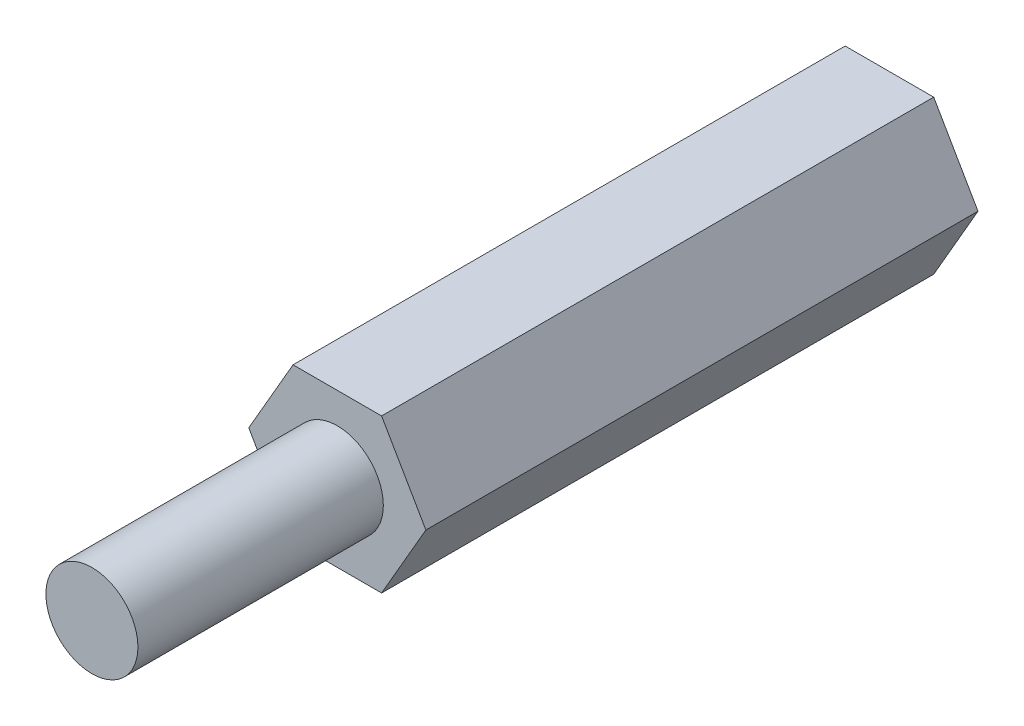
ISO-10303-21;
HEADER;
FILE_DESCRIPTION(('STEP AP214'),'2;1');
FILE_NAME('part.step','',(''),(''),'','','');
FILE_SCHEMA(('AUTOMOTIVE_DESIGN { 1 0 10303 214 1 1 1 1 }'));
ENDSEC;
DATA;
#1=APPLICATION_CONTEXT('core data for automotive mechanical design processes');
#2=APPLICATION_PROTOCOL_DEFINITION('international standard','automotive_design',2000,#1);
#3=PRODUCT_CONTEXT('',#1,'mechanical');
#4=PRODUCT('Part','Part','',(#3));
#5=PRODUCT_RELATED_PRODUCT_CATEGORY('part','',(#4));
#6=PRODUCT_DEFINITION_FORMATION('','',#4);
#7=PRODUCT_DEFINITION_CONTEXT('part definition',#1,'design');
#8=PRODUCT_DEFINITION('design','',#6,#7);
#9=PRODUCT_DEFINITION_SHAPE('','',#8);
#10=(LENGTH_UNIT() NAMED_UNIT(*) SI_UNIT(.MILLI.,.METRE.));
#11=(NAMED_UNIT(*) PLANE_ANGLE_UNIT() SI_UNIT($,.RADIAN.));
#12=(NAMED_UNIT(*) SI_UNIT($,.STERADIAN.) SOLID_ANGLE_UNIT());
#13=UNCERTAINTY_MEASURE_WITH_UNIT(LENGTH_MEASURE(1.E-05),#10,'distance_accuracy_value','');
#14=(GEOMETRIC_REPRESENTATION_CONTEXT(3) GLOBAL_UNCERTAINTY_ASSIGNED_CONTEXT((#13)) GLOBAL_UNIT_ASSIGNED_CONTEXT((#10,
#11,#12)) REPRESENTATION_CONTEXT('',''));
#15=CARTESIAN_POINT('',(0.,0.,0.));
#16=DIRECTION('',(0.,0.,1.));
#17=DIRECTION('',(1.,0.,0.));
#18=AXIS2_PLACEMENT_3D('',#15,#16,#17);
#19=CARTESIAN_POINT('',(1.44337567297407,2.5,18.));
#20=DIRECTION('',(0.,-1.,0.));
#21=DIRECTION('',(0.,0.,-1.));
#22=AXIS2_PLACEMENT_3D('',#19,#20,#21);
#23=PLANE('',#22);
#24=DIRECTION('',(-1.,0.,0.));
#25=VECTOR('',#24,1.);
#26=CARTESIAN_POINT('',(1.44337567297407,2.5,0.));
#27=LINE('',#26,#25);
#28=CARTESIAN_POINT('',(1.44337567297407,2.5,0.));
#29=VERTEX_POINT('',#28);
#30=CARTESIAN_POINT('',(-1.44337567297406,2.5,0.));
#31=VERTEX_POINT('',#30);
#32=EDGE_CURVE('E124',#29,#31,#27,.T.);
#33=ORIENTED_EDGE('',*,*,#32,.T.);
#34=DIRECTION('',(0.,0.,-1.));
#35=VECTOR('',#34,1.);
#36=CARTESIAN_POINT('',(-1.44337567297406,2.5,18.));
#37=LINE('',#36,#35);
#38=CARTESIAN_POINT('',(-1.44337567297406,2.5,18.));
#39=VERTEX_POINT('',#38);
#40=EDGE_CURVE('E11',#39,#31,#37,.T.);
#41=ORIENTED_EDGE('',*,*,#40,.F.);
#42=DIRECTION('',(-1.,0.,0.));
#43=VECTOR('',#42,1.);
#44=CARTESIAN_POINT('',(1.44337567297407,2.5,18.));
#45=LINE('',#44,#43);
#46=CARTESIAN_POINT('',(1.44337567297407,2.5,18.));
#47=VERTEX_POINT('',#46);
#48=EDGE_CURVE('E135',#47,#39,#45,.T.);
#49=ORIENTED_EDGE('',*,*,#48,.F.);
#50=DIRECTION('',(0.,0.,-1.));
#51=VECTOR('',#50,1.);
#52=CARTESIAN_POINT('',(1.44337567297407,2.5,18.));
#53=LINE('',#52,#51);
#54=EDGE_CURVE('E120',#47,#29,#53,.T.);
#55=ORIENTED_EDGE('',*,*,#54,.T.);
#56=EDGE_LOOP('',(#33,#41,#49,#55));
#57=FACE_BOUND('',#56,.T.);
#58=ADVANCED_FACE('F38',(#57),#23,.F.);
#59=CARTESIAN_POINT('',(-1.44337567297406,2.5,18.));
#60=DIRECTION('',(0.866025403784439,-0.5,0.));
#61=DIRECTION('',(0.5,0.866025403784439,0.));
#62=AXIS2_PLACEMENT_3D('',#59,#60,#61);
#63=PLANE('',#62);
#64=DIRECTION('',(-0.5,-0.866025403784439,0.));
#65=VECTOR('',#64,1.);
#66=CARTESIAN_POINT('',(-1.44337567297406,2.5,0.));
#67=LINE('',#66,#65);
#68=CARTESIAN_POINT('',(-2.88675134594813,0.,0.));
#69=VERTEX_POINT('',#68);
#70=EDGE_CURVE('E127',#31,#69,#67,.T.);
#71=ORIENTED_EDGE('',*,*,#70,.T.);
#72=DIRECTION('',(0.,0.,-1.));
#73=VECTOR('',#72,1.);
#74=CARTESIAN_POINT('',(-2.88675134594813,0.,18.));
#75=LINE('',#74,#73);
#76=CARTESIAN_POINT('',(-2.88675134594813,0.,18.));
#77=VERTEX_POINT('',#76);
#78=EDGE_CURVE('E46',#77,#69,#75,.T.);
#79=ORIENTED_EDGE('',*,*,#78,.F.);
#80=DIRECTION('',(-0.5,-0.866025403784439,0.));
#81=VECTOR('',#80,1.);
#82=CARTESIAN_POINT('',(-1.44337567297406,2.5,18.));
#83=LINE('',#82,#81);
#84=EDGE_CURVE('E92',#39,#77,#83,.T.);
#85=ORIENTED_EDGE('',*,*,#84,.F.);
#86=ORIENTED_EDGE('',*,*,#40,.T.);
#87=EDGE_LOOP('',(#71,#79,#85,#86));
#88=FACE_BOUND('',#87,.T.);
#89=ADVANCED_FACE('F160',(#88),#63,.F.);
#90=CARTESIAN_POINT('',(-2.88675134594813,0.,18.));
#91=DIRECTION('',(0.866025403784438,0.5,0.));
#92=DIRECTION('',(-0.5,0.866025403784438,0.));
#93=AXIS2_PLACEMENT_3D('',#90,#91,#92);
#94=PLANE('',#93);
#95=DIRECTION('',(0.5,-0.866025403784438,0.));
#96=VECTOR('',#95,1.);
#97=CARTESIAN_POINT('',(-2.88675134594813,0.,0.));
#98=LINE('',#97,#96);
#99=CARTESIAN_POINT('',(-1.44337567297406,-2.5,0.));
#100=VERTEX_POINT('',#99);
#101=EDGE_CURVE('E130',#69,#100,#98,.T.);
#102=ORIENTED_EDGE('',*,*,#101,.T.);
#103=DIRECTION('',(0.,0.,-1.));
#104=VECTOR('',#103,1.);
#105=CARTESIAN_POINT('',(-1.44337567297406,-2.5,18.));
#106=LINE('',#105,#104);
#107=CARTESIAN_POINT('',(-1.44337567297406,-2.5,18.));
#108=VERTEX_POINT('',#107);
#109=EDGE_CURVE('E115',#108,#100,#106,.T.);
#110=ORIENTED_EDGE('',*,*,#109,.F.);
#111=DIRECTION('',(0.5,-0.866025403784438,0.));
#112=VECTOR('',#111,1.);
#113=CARTESIAN_POINT('',(-2.88675134594813,0.,18.));
#114=LINE('',#113,#112);
#115=EDGE_CURVE('E106',#77,#108,#114,.T.);
#116=ORIENTED_EDGE('',*,*,#115,.F.);
#117=ORIENTED_EDGE('',*,*,#78,.T.);
#118=EDGE_LOOP('',(#102,#110,#116,#117));
#119=FACE_BOUND('',#118,.T.);
#120=ADVANCED_FACE('F141',(#119),#94,.F.);
#121=CARTESIAN_POINT('',(-1.44337567297406,-2.5,18.));
#122=DIRECTION('',(0.,1.,0.));
#123=DIRECTION('',(-1.,0.,0.));
#124=AXIS2_PLACEMENT_3D('',#121,#122,#123);
#125=PLANE('',#124);
#126=DIRECTION('',(1.,0.,0.));
#127=VECTOR('',#126,1.);
#128=CARTESIAN_POINT('',(-1.44337567297406,-2.5,0.));
#129=LINE('',#128,#127);
#130=CARTESIAN_POINT('',(1.44337567297406,-2.5,0.));
#131=VERTEX_POINT('',#130);
#132=EDGE_CURVE('E114',#100,#131,#129,.T.);
#133=ORIENTED_EDGE('',*,*,#132,.T.);
#134=DIRECTION('',(0.,0.,-1.));
#135=VECTOR('',#134,1.);
#136=CARTESIAN_POINT('',(1.44337567297406,-2.5,18.));
#137=LINE('',#136,#135);
#138=CARTESIAN_POINT('',(1.44337567297406,-2.5,18.));
#139=VERTEX_POINT('',#138);
#140=EDGE_CURVE('E111',#139,#131,#137,.T.);
#141=ORIENTED_EDGE('',*,*,#140,.F.);
#142=DIRECTION('',(1.,0.,0.));
#143=VECTOR('',#142,1.);
#144=CARTESIAN_POINT('',(-1.44337567297406,-2.5,18.));
#145=LINE('',#144,#143);
#146=EDGE_CURVE('E100',#108,#139,#145,.T.);
#147=ORIENTED_EDGE('',*,*,#146,.F.);
#148=ORIENTED_EDGE('',*,*,#109,.T.);
#149=EDGE_LOOP('',(#133,#141,#147,#148));
#150=FACE_BOUND('',#149,.T.);
#151=ADVANCED_FACE('F112',(#150),#125,.F.);
#152=CARTESIAN_POINT('',(1.44337567297406,-2.5,18.));
#153=DIRECTION('',(-0.866025403784439,0.5,0.));
#154=DIRECTION('',(-0.5,-0.866025403784439,0.));
#155=AXIS2_PLACEMENT_3D('',#152,#153,#154);
#156=PLANE('',#155);
#157=DIRECTION('',(0.5,0.866025403784439,0.));
#158=VECTOR('',#157,1.);
#159=CARTESIAN_POINT('',(1.44337567297406,-2.5,0.));
#160=LINE('',#159,#158);
#161=CARTESIAN_POINT('',(2.88675134594813,0.,0.));
#162=VERTEX_POINT('',#161);
#163=EDGE_CURVE('E78',#131,#162,#160,.T.);
#164=ORIENTED_EDGE('',*,*,#163,.T.);
#165=DIRECTION('',(0.,0.,-1.));
#166=VECTOR('',#165,1.);
#167=CARTESIAN_POINT('',(2.88675134594813,0.,18.));
#168=LINE('',#167,#166);
#169=CARTESIAN_POINT('',(2.88675134594813,0.,18.));
#170=VERTEX_POINT('',#169);
#171=EDGE_CURVE('E116',#170,#162,#168,.T.);
#172=ORIENTED_EDGE('',*,*,#171,.F.);
#173=DIRECTION('',(0.5,0.866025403784439,0.));
#174=VECTOR('',#173,1.);
#175=CARTESIAN_POINT('',(1.44337567297406,-2.5,18.));
#176=LINE('',#175,#174);
#177=EDGE_CURVE('E104',#139,#170,#176,.T.);
#178=ORIENTED_EDGE('',*,*,#177,.F.);
#179=ORIENTED_EDGE('',*,*,#140,.T.);
#180=EDGE_LOOP('',(#164,#172,#178,#179));
#181=FACE_BOUND('',#180,.T.);
#182=ADVANCED_FACE('F118',(#181),#156,.F.);
#183=CARTESIAN_POINT('',(2.88675134594813,0.,18.));
#184=DIRECTION('',(-0.866025403784439,-0.5,0.));
#185=DIRECTION('',(0.5,-0.866025403784439,0.));
#186=AXIS2_PLACEMENT_3D('',#183,#184,#185);
#187=PLANE('',#186);
#188=DIRECTION('',(-0.5,0.866025403784439,0.));
#189=VECTOR('',#188,1.);
#190=CARTESIAN_POINT('',(2.88675134594813,0.,0.));
#191=LINE('',#190,#189);
#192=EDGE_CURVE('E84',#162,#29,#191,.T.);
#193=ORIENTED_EDGE('',*,*,#192,.T.);
#194=ORIENTED_EDGE('',*,*,#54,.F.);
#195=DIRECTION('',(-0.5,0.866025403784439,0.));
#196=VECTOR('',#195,1.);
#197=CARTESIAN_POINT('',(2.88675134594813,0.,18.));
#198=LINE('',#197,#196);
#199=EDGE_CURVE('E54',#170,#47,#198,.T.);
#200=ORIENTED_EDGE('',*,*,#199,.F.);
#201=ORIENTED_EDGE('',*,*,#171,.T.);
#202=EDGE_LOOP('',(#193,#194,#200,#201));
#203=FACE_BOUND('',#202,.T.);
#204=ADVANCED_FACE('F148',(#203),#187,.F.);
#205=CARTESIAN_POINT('',(0.,0.,18.));
#206=DIRECTION('',(0.,0.,1.));
#207=DIRECTION('',(1.,0.,0.));
#208=AXIS2_PLACEMENT_3D('',#205,#206,#207);
#209=PLANE('',#208);
#210=CARTESIAN_POINT('',(0.,0.,18.));
#211=DIRECTION('',(0.,0.,1.));
#212=DIRECTION('',(1.,0.,0.));
#213=AXIS2_PLACEMENT_3D('',#210,#211,#212);
#214=CIRCLE('',#213,1.5);
#215=CARTESIAN_POINT('',(1.5,0.,18.));
#216=VERTEX_POINT('',#215);
#217=EDGE_CURVE('E251',#216,#216,#214,.T.);
#218=ORIENTED_EDGE('',*,*,#217,.F.);
#219=EDGE_LOOP('',(#218));
#220=FACE_BOUND('',#219,.T.);
#221=ORIENTED_EDGE('',*,*,#48,.T.);
#222=ORIENTED_EDGE('',*,*,#84,.T.);
#223=ORIENTED_EDGE('',*,*,#115,.T.);
#224=ORIENTED_EDGE('',*,*,#146,.T.);
#225=ORIENTED_EDGE('',*,*,#177,.T.);
#226=ORIENTED_EDGE('',*,*,#199,.T.);
#227=EDGE_LOOP('',(#221,#222,#223,#224,#225,#226));
#228=FACE_BOUND('',#227,.T.);
#229=ADVANCED_FACE('F102',(#220,#228),#209,.T.);
#230=CARTESIAN_POINT('',(0.,0.,0.));
#231=DIRECTION('',(0.,0.,1.));
#232=DIRECTION('',(1.,0.,0.));
#233=AXIS2_PLACEMENT_3D('',#230,#231,#232);
#234=PLANE('',#233);
#235=CARTESIAN_POINT('',(0.,0.,0.));
#236=DIRECTION('',(0.,0.,-1.));
#237=DIRECTION('',(-1.,0.,0.));
#238=AXIS2_PLACEMENT_3D('',#235,#236,#237);
#239=CIRCLE('',#238,1.24999999999999);
#240=CARTESIAN_POINT('',(-1.24999999999999,0.,0.));
#241=VERTEX_POINT('',#240);
#242=EDGE_CURVE('E249',#241,#241,#239,.T.);
#243=ORIENTED_EDGE('',*,*,#242,.F.);
#244=EDGE_LOOP('',(#243));
#245=FACE_BOUND('',#244,.T.);
#246=ORIENTED_EDGE('',*,*,#32,.F.);
#247=ORIENTED_EDGE('',*,*,#192,.F.);
#248=ORIENTED_EDGE('',*,*,#163,.F.);
#249=ORIENTED_EDGE('',*,*,#132,.F.);
#250=ORIENTED_EDGE('',*,*,#101,.F.);
#251=ORIENTED_EDGE('',*,*,#70,.F.);
#252=EDGE_LOOP('',(#246,#247,#248,#249,#250,#251));
#253=FACE_BOUND('',#252,.T.);
#254=ADVANCED_FACE('F144',(#245,#253),#234,.F.);
#255=CARTESIAN_POINT('',(0.,0.,26.));
#256=DIRECTION('',(0.,0.,-1.));
#257=DIRECTION('',(-1.,0.,0.));
#258=AXIS2_PLACEMENT_3D('',#255,#256,#257);
#259=CYLINDRICAL_SURFACE('',#258,1.5);
#260=CARTESIAN_POINT('',(0.,0.,26.));
#261=DIRECTION('',(0.,0.,1.));
#262=DIRECTION('',(1.,0.,0.));
#263=AXIS2_PLACEMENT_3D('',#260,#261,#262);
#264=CIRCLE('',#263,1.5);
#265=CARTESIAN_POINT('',(1.5,0.,26.));
#266=VERTEX_POINT('',#265);
#267=EDGE_CURVE('E128',#266,#266,#264,.T.);
#268=ORIENTED_EDGE('',*,*,#267,.F.);
#269=EDGE_LOOP('',(#268));
#270=FACE_BOUND('',#269,.T.);
#271=ORIENTED_EDGE('',*,*,#217,.T.);
#272=EDGE_LOOP('',(#271));
#273=FACE_BOUND('',#272,.T.);
#274=ADVANCED_FACE('F195',(#270,#273),#259,.T.);
#275=CARTESIAN_POINT('',(0.,0.,26.));
#276=DIRECTION('',(0.,0.,1.));
#277=DIRECTION('',(1.,0.,0.));
#278=AXIS2_PLACEMENT_3D('',#275,#276,#277);
#279=PLANE('',#278);
#280=ORIENTED_EDGE('',*,*,#267,.T.);
#281=EDGE_LOOP('',(#280));
#282=FACE_BOUND('',#281,.T.);
#283=ADVANCED_FACE('F201',(#282),#279,.T.);
#284=CARTESIAN_POINT('',(0.,0.,8.));
#285=DIRECTION('',(0.,0.,-1.));
#286=DIRECTION('',(-1.,0.,0.));
#287=AXIS2_PLACEMENT_3D('',#284,#285,#286);
#288=CONICAL_SURFACE('',#287,1.25,1.02974425867665);
#289=CARTESIAN_POINT('',(0.,0.,8.75107577378445));
#290=VERTEX_POINT('',#289);
#291=VERTEX_LOOP('',#290);
#292=FACE_BOUND('',#291,.T.);
#293=CARTESIAN_POINT('',(0.,0.,8.));
#294=DIRECTION('',(0.,0.,-1.));
#295=DIRECTION('',(-1.,0.,0.));
#296=AXIS2_PLACEMENT_3D('',#293,#294,#295);
#297=CIRCLE('',#296,1.25);
#298=CARTESIAN_POINT('',(-1.25,0.,8.));
#299=VERTEX_POINT('',#298);
#300=EDGE_CURVE('E246',#299,#299,#297,.T.);
#301=ORIENTED_EDGE('',*,*,#300,.T.);
#302=EDGE_LOOP('',(#301));
#303=FACE_BOUND('',#302,.T.);
#304=ADVANCED_FACE('F212',(#292,#303),#288,.F.);
#305=CARTESIAN_POINT('',(0.,0.,0.));
#306=DIRECTION('',(0.,0.,-1.));
#307=DIRECTION('',(-1.,0.,0.));
#308=AXIS2_PLACEMENT_3D('',#305,#306,#307);
#309=CYLINDRICAL_SURFACE('',#308,1.24999999999999);
#310=ORIENTED_EDGE('',*,*,#300,.F.);
#311=EDGE_LOOP('',(#310));
#312=FACE_BOUND('',#311,.T.);
#313=ORIENTED_EDGE('',*,*,#242,.T.);
#314=EDGE_LOOP('',(#313));
#315=FACE_BOUND('',#314,.T.);
#316=ADVANCED_FACE('F228',(#312,#315),#309,.F.);
#317=CLOSED_SHELL('',(#58,#89,#120,#151,#182,#204,#229,#254,#274,#283,#304,#316));
#318=MANIFOLD_SOLID_BREP('B2',#317);
#319=ADVANCED_BREP_SHAPE_REPRESENTATION('',(#18,#318),#14);
#320=SHAPE_DEFINITION_REPRESENTATION(#9,#319);
ENDSEC;
END-ISO-10303-21;
